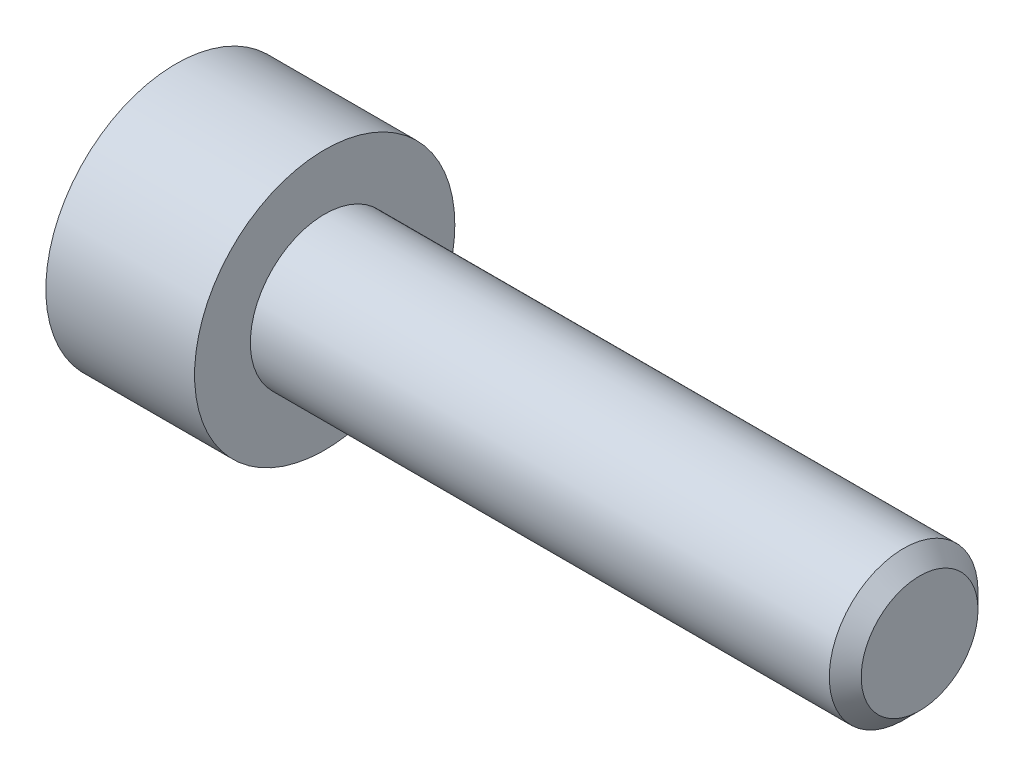
ISO-10303-21;
HEADER;
FILE_DESCRIPTION(('STEP AP214'),'2;1');
FILE_NAME('part.step','',(''),(''),'','','');
FILE_SCHEMA(('AUTOMOTIVE_DESIGN { 1 0 10303 214 1 1 1 1 }'));
ENDSEC;
DATA;
#1=APPLICATION_CONTEXT('core data for automotive mechanical design processes');
#2=APPLICATION_PROTOCOL_DEFINITION('international standard','automotive_design',2000,#1);
#3=PRODUCT_CONTEXT('',#1,'mechanical');
#4=PRODUCT('Part','Part','',(#3));
#5=PRODUCT_RELATED_PRODUCT_CATEGORY('part','',(#4));
#6=PRODUCT_DEFINITION_FORMATION('','',#4);
#7=PRODUCT_DEFINITION_CONTEXT('part definition',#1,'design');
#8=PRODUCT_DEFINITION('design','',#6,#7);
#9=PRODUCT_DEFINITION_SHAPE('','',#8);
#10=(LENGTH_UNIT() NAMED_UNIT(*) SI_UNIT(.MILLI.,.METRE.));
#11=(NAMED_UNIT(*) PLANE_ANGLE_UNIT() SI_UNIT($,.RADIAN.));
#12=(NAMED_UNIT(*) SI_UNIT($,.STERADIAN.) SOLID_ANGLE_UNIT());
#13=UNCERTAINTY_MEASURE_WITH_UNIT(LENGTH_MEASURE(1.E-05),#10,'distance_accuracy_value','');
#14=(GEOMETRIC_REPRESENTATION_CONTEXT(3) GLOBAL_UNCERTAINTY_ASSIGNED_CONTEXT((#13)) GLOBAL_UNIT_ASSIGNED_CONTEXT((#10,
#11,#12)) REPRESENTATION_CONTEXT('',''));
#15=CARTESIAN_POINT('',(0.,0.,0.));
#16=DIRECTION('',(0.,0.,1.));
#17=DIRECTION('',(1.,0.,0.));
#18=AXIS2_PLACEMENT_3D('',#15,#16,#17);
#19=CARTESIAN_POINT('',(16.,0.,0.));
#20=DIRECTION('',(-1.,0.,0.));
#21=DIRECTION('',(0.,0.,-1.));
#22=AXIS2_PLACEMENT_3D('',#19,#20,#21);
#23=CYLINDRICAL_SURFACE('',#22,3.5);
#24=CARTESIAN_POINT('',(-4.,0.,0.));
#25=DIRECTION('',(1.,0.,0.));
#26=DIRECTION('',(0.,0.,-1.));
#27=AXIS2_PLACEMENT_3D('',#24,#25,#26);
#28=CIRCLE('',#27,3.5);
#29=CARTESIAN_POINT('',(-4.,0.,-3.5));
#30=VERTEX_POINT('',#29);
#31=EDGE_CURVE('E11',#30,#30,#28,.T.);
#32=ORIENTED_EDGE('',*,*,#31,.T.);
#33=EDGE_LOOP('',(#32));
#34=FACE_BOUND('',#33,.T.);
#35=CARTESIAN_POINT('',(0.,0.,0.));
#36=DIRECTION('',(1.,0.,0.));
#37=DIRECTION('',(0.,0.,-1.));
#38=AXIS2_PLACEMENT_3D('',#35,#36,#37);
#39=CIRCLE('',#38,3.5);
#40=CARTESIAN_POINT('',(0.,0.,-3.5));
#41=VERTEX_POINT('',#40);
#42=EDGE_CURVE('E205',#41,#41,#39,.T.);
#43=ORIENTED_EDGE('',*,*,#42,.F.);
#44=EDGE_LOOP('',(#43));
#45=FACE_BOUND('',#44,.T.);
#46=ADVANCED_FACE('F16',(#34,#45),#23,.T.);
#47=CARTESIAN_POINT('',(-4.,0.,0.));
#48=DIRECTION('',(1.,0.,0.));
#49=DIRECTION('',(0.,1.,0.));
#50=AXIS2_PLACEMENT_3D('',#47,#48,#49);
#51=PLANE('',#50);
#52=ORIENTED_EDGE('',*,*,#31,.F.);
#53=EDGE_LOOP('',(#52));
#54=FACE_BOUND('',#53,.T.);
#55=DIRECTION('',(0.,-1.,0.));
#56=VECTOR('',#55,1.);
#57=CARTESIAN_POINT('',(-4.,0.866025403784439,1.5));
#58=LINE('',#57,#56);
#59=CARTESIAN_POINT('',(-4.,0.866025403784439,1.5));
#60=VERTEX_POINT('',#59);
#61=CARTESIAN_POINT('',(-4.,-0.866025403784439,1.5));
#62=VERTEX_POINT('',#61);
#63=EDGE_CURVE('E27',#60,#62,#58,.T.);
#64=ORIENTED_EDGE('',*,*,#63,.T.);
#65=DIRECTION('',(0.,-0.5,-0.866025403784439));
#66=VECTOR('',#65,1.);
#67=CARTESIAN_POINT('',(-4.,-0.866025403784439,1.5));
#68=LINE('',#67,#66);
#69=CARTESIAN_POINT('',(-4.,-1.73205080756888,0.));
#70=VERTEX_POINT('',#69);
#71=EDGE_CURVE('E196',#62,#70,#68,.T.);
#72=ORIENTED_EDGE('',*,*,#71,.T.);
#73=DIRECTION('',(0.,0.5,-0.866025403784439));
#74=VECTOR('',#73,1.);
#75=CARTESIAN_POINT('',(-4.,-1.73205080756888,0.));
#76=LINE('',#75,#74);
#77=CARTESIAN_POINT('',(-4.,-0.866025403784439,-1.5));
#78=VERTEX_POINT('',#77);
#79=EDGE_CURVE('E200',#70,#78,#76,.T.);
#80=ORIENTED_EDGE('',*,*,#79,.T.);
#81=DIRECTION('',(0.,1.,0.));
#82=VECTOR('',#81,1.);
#83=CARTESIAN_POINT('',(-4.,-0.866025403784439,-1.5));
#84=LINE('',#83,#82);
#85=CARTESIAN_POINT('',(-4.,0.866025403784438,-1.5));
#86=VERTEX_POINT('',#85);
#87=EDGE_CURVE('E223',#78,#86,#84,.T.);
#88=ORIENTED_EDGE('',*,*,#87,.T.);
#89=DIRECTION('',(0.,0.5,0.866025403784439));
#90=VECTOR('',#89,1.);
#91=CARTESIAN_POINT('',(-4.,0.866025403784439,-1.5));
#92=LINE('',#91,#90);
#93=CARTESIAN_POINT('',(-4.,1.73205080756888,0.));
#94=VERTEX_POINT('',#93);
#95=EDGE_CURVE('E219',#86,#94,#92,.T.);
#96=ORIENTED_EDGE('',*,*,#95,.T.);
#97=DIRECTION('',(0.,-0.5,0.866025403784439));
#98=VECTOR('',#97,1.);
#99=CARTESIAN_POINT('',(-4.,1.73205080756888,0.));
#100=LINE('',#99,#98);
#101=EDGE_CURVE('E224',#94,#60,#100,.T.);
#102=ORIENTED_EDGE('',*,*,#101,.T.);
#103=EDGE_LOOP('',(#64,#72,#80,#88,#96,#102));
#104=FACE_BOUND('',#103,.T.);
#105=ADVANCED_FACE('F146',(#54,#104),#51,.F.);
#106=CARTESIAN_POINT('',(-2.,-0.866025403784439,1.5));
#107=DIRECTION('',(0.,0.866025403784439,-0.5));
#108=DIRECTION('',(-1.,0.,0.));
#109=AXIS2_PLACEMENT_3D('',#106,#107,#108);
#110=PLANE('',#109);
#111=ORIENTED_EDGE('',*,*,#71,.F.);
#112=DIRECTION('',(-1.,0.,0.));
#113=VECTOR('',#112,1.);
#114=CARTESIAN_POINT('',(-2.,-0.866025403784439,1.5));
#115=LINE('',#114,#113);
#116=CARTESIAN_POINT('',(-2.,-0.866025403784439,1.5));
#117=VERTEX_POINT('',#116);
#118=EDGE_CURVE('E180',#117,#62,#115,.T.);
#119=ORIENTED_EDGE('',*,*,#118,.F.);
#120=DIRECTION('',(0.,-0.5,-0.866025403784439));
#121=VECTOR('',#120,1.);
#122=CARTESIAN_POINT('',(-2.,-0.866025403784439,1.5));
#123=LINE('',#122,#121);
#124=CARTESIAN_POINT('',(-2.,-1.73205080756888,0.));
#125=VERTEX_POINT('',#124);
#126=EDGE_CURVE('E226',#117,#125,#123,.T.);
#127=ORIENTED_EDGE('',*,*,#126,.T.);
#128=DIRECTION('',(-1.,0.,0.));
#129=VECTOR('',#128,1.);
#130=CARTESIAN_POINT('',(-2.,-1.73205080756888,0.));
#131=LINE('',#130,#129);
#132=EDGE_CURVE('E85',#125,#70,#131,.T.);
#133=ORIENTED_EDGE('',*,*,#132,.T.);
#134=EDGE_LOOP('',(#111,#119,#127,#133));
#135=FACE_BOUND('',#134,.T.);
#136=ADVANCED_FACE('F152',(#135),#110,.T.);
#137=CARTESIAN_POINT('',(-2.,-1.73205080756888,0.));
#138=DIRECTION('',(0.,0.866025403784439,0.5));
#139=DIRECTION('',(1.,0.,0.));
#140=AXIS2_PLACEMENT_3D('',#137,#138,#139);
#141=PLANE('',#140);
#142=ORIENTED_EDGE('',*,*,#79,.F.);
#143=ORIENTED_EDGE('',*,*,#132,.F.);
#144=DIRECTION('',(0.,0.5,-0.866025403784439));
#145=VECTOR('',#144,1.);
#146=CARTESIAN_POINT('',(-2.,-1.73205080756888,0.));
#147=LINE('',#146,#145);
#148=CARTESIAN_POINT('',(-2.,-0.866025403784439,-1.5));
#149=VERTEX_POINT('',#148);
#150=EDGE_CURVE('E20',#125,#149,#147,.T.);
#151=ORIENTED_EDGE('',*,*,#150,.T.);
#152=DIRECTION('',(-1.,0.,0.));
#153=VECTOR('',#152,1.);
#154=CARTESIAN_POINT('',(-2.,-0.866025403784439,-1.5));
#155=LINE('',#154,#153);
#156=EDGE_CURVE('E99',#149,#78,#155,.T.);
#157=ORIENTED_EDGE('',*,*,#156,.T.);
#158=EDGE_LOOP('',(#142,#143,#151,#157));
#159=FACE_BOUND('',#158,.T.);
#160=ADVANCED_FACE('F248',(#159),#141,.T.);
#161=CARTESIAN_POINT('',(-2.,0.866025403784439,1.5));
#162=DIRECTION('',(0.,0.,-1.));
#163=DIRECTION('',(0.,-1.,0.));
#164=AXIS2_PLACEMENT_3D('',#161,#162,#163);
#165=PLANE('',#164);
#166=ORIENTED_EDGE('',*,*,#63,.F.);
#167=DIRECTION('',(-1.,0.,0.));
#168=VECTOR('',#167,1.);
#169=CARTESIAN_POINT('',(-2.,0.866025403784439,1.5));
#170=LINE('',#169,#168);
#171=CARTESIAN_POINT('',(-2.,0.866025403784439,1.5));
#172=VERTEX_POINT('',#171);
#173=EDGE_CURVE('E233',#172,#60,#170,.T.);
#174=ORIENTED_EDGE('',*,*,#173,.F.);
#175=DIRECTION('',(0.,-1.,0.));
#176=VECTOR('',#175,1.);
#177=CARTESIAN_POINT('',(-2.,0.866025403784439,1.5));
#178=LINE('',#177,#176);
#179=EDGE_CURVE('E187',#172,#117,#178,.T.);
#180=ORIENTED_EDGE('',*,*,#179,.T.);
#181=ORIENTED_EDGE('',*,*,#118,.T.);
#182=EDGE_LOOP('',(#166,#174,#180,#181));
#183=FACE_BOUND('',#182,.T.);
#184=ADVANCED_FACE('F18',(#183),#165,.T.);
#185=CARTESIAN_POINT('',(16.,1.5705,0.));
#186=DIRECTION('',(-1.,0.,0.));
#187=DIRECTION('',(0.,0.,1.));
#188=AXIS2_PLACEMENT_3D('',#185,#186,#187);
#189=PLANE('',#188);
#190=CARTESIAN_POINT('',(16.,0.,0.));
#191=DIRECTION('',(1.,0.,0.));
#192=DIRECTION('',(0.,0.,-1.));
#193=AXIS2_PLACEMENT_3D('',#190,#191,#192);
#194=CIRCLE('',#193,1.5705);
#195=CARTESIAN_POINT('',(16.,0.,-1.5705));
#196=VERTEX_POINT('',#195);
#197=EDGE_CURVE('E178',#196,#196,#194,.T.);
#198=ORIENTED_EDGE('',*,*,#197,.T.);
#199=EDGE_LOOP('',(#198));
#200=FACE_BOUND('',#199,.T.);
#201=ADVANCED_FACE('F164',(#200),#189,.F.);
#202=CARTESIAN_POINT('',(15.5705,0.,0.));
#203=DIRECTION('',(-1.,0.,0.));
#204=DIRECTION('',(0.,0.,1.));
#205=AXIS2_PLACEMENT_3D('',#202,#203,#204);
#206=CONICAL_SURFACE('',#205,2.,0.785398163397445);
#207=CARTESIAN_POINT('',(15.5705,0.,0.));
#208=DIRECTION('',(1.,0.,0.));
#209=DIRECTION('',(0.,0.,-1.));
#210=AXIS2_PLACEMENT_3D('',#207,#208,#209);
#211=CIRCLE('',#210,2.);
#212=CARTESIAN_POINT('',(15.5705,0.,-2.));
#213=VERTEX_POINT('',#212);
#214=EDGE_CURVE('E176',#213,#213,#211,.T.);
#215=ORIENTED_EDGE('',*,*,#214,.T.);
#216=EDGE_LOOP('',(#215));
#217=FACE_BOUND('',#216,.T.);
#218=ORIENTED_EDGE('',*,*,#197,.F.);
#219=EDGE_LOOP('',(#218));
#220=FACE_BOUND('',#219,.T.);
#221=ADVANCED_FACE('F162',(#217,#220),#206,.T.);
#222=CARTESIAN_POINT('',(16.,0.,0.));
#223=DIRECTION('',(-1.,0.,0.));
#224=DIRECTION('',(0.,0.,-1.));
#225=AXIS2_PLACEMENT_3D('',#222,#223,#224);
#226=CYLINDRICAL_SURFACE('',#225,2.);
#227=CARTESIAN_POINT('',(0.,0.,0.));
#228=DIRECTION('',(1.,0.,0.));
#229=DIRECTION('',(0.,0.,-1.));
#230=AXIS2_PLACEMENT_3D('',#227,#228,#229);
#231=CIRCLE('',#230,2.);
#232=CARTESIAN_POINT('',(0.,0.,-2.));
#233=VERTEX_POINT('',#232);
#234=EDGE_CURVE('E189',#233,#233,#231,.T.);
#235=ORIENTED_EDGE('',*,*,#234,.T.);
#236=EDGE_LOOP('',(#235));
#237=FACE_BOUND('',#236,.T.);
#238=ORIENTED_EDGE('',*,*,#214,.F.);
#239=EDGE_LOOP('',(#238));
#240=FACE_BOUND('',#239,.T.);
#241=ADVANCED_FACE('F160',(#237,#240),#226,.T.);
#242=CARTESIAN_POINT('',(0.,3.5,0.));
#243=DIRECTION('',(-1.,0.,0.));
#244=DIRECTION('',(0.,0.,1.));
#245=AXIS2_PLACEMENT_3D('',#242,#243,#244);
#246=PLANE('',#245);
#247=ORIENTED_EDGE('',*,*,#42,.T.);
#248=EDGE_LOOP('',(#247));
#249=FACE_BOUND('',#248,.T.);
#250=ORIENTED_EDGE('',*,*,#234,.F.);
#251=EDGE_LOOP('',(#250));
#252=FACE_BOUND('',#251,.T.);
#253=ADVANCED_FACE('F157',(#249,#252),#246,.F.);
#254=CARTESIAN_POINT('',(-2.,-0.866025403784439,-1.5));
#255=DIRECTION('',(0.,0.,1.));
#256=DIRECTION('',(1.,0.,0.));
#257=AXIS2_PLACEMENT_3D('',#254,#255,#256);
#258=PLANE('',#257);
#259=ORIENTED_EDGE('',*,*,#87,.F.);
#260=ORIENTED_EDGE('',*,*,#156,.F.);
#261=DIRECTION('',(0.,1.,0.));
#262=VECTOR('',#261,1.);
#263=CARTESIAN_POINT('',(-2.,-0.866025403784439,-1.5));
#264=LINE('',#263,#262);
#265=CARTESIAN_POINT('',(-2.,0.866025403784438,-1.5));
#266=VERTEX_POINT('',#265);
#267=EDGE_CURVE('E202',#149,#266,#264,.T.);
#268=ORIENTED_EDGE('',*,*,#267,.T.);
#269=DIRECTION('',(-1.,0.,0.));
#270=VECTOR('',#269,1.);
#271=CARTESIAN_POINT('',(-2.,0.866025403784438,-1.5));
#272=LINE('',#271,#270);
#273=EDGE_CURVE('E115',#266,#86,#272,.T.);
#274=ORIENTED_EDGE('',*,*,#273,.T.);
#275=EDGE_LOOP('',(#259,#260,#268,#274));
#276=FACE_BOUND('',#275,.T.);
#277=ADVANCED_FACE('F159',(#276),#258,.T.);
#278=CARTESIAN_POINT('',(-2.,0.866025403784439,-1.5));
#279=DIRECTION('',(0.,-0.866025403784439,0.5));
#280=DIRECTION('',(-1.,0.,0.));
#281=AXIS2_PLACEMENT_3D('',#278,#279,#280);
#282=PLANE('',#281);
#283=ORIENTED_EDGE('',*,*,#95,.F.);
#284=ORIENTED_EDGE('',*,*,#273,.F.);
#285=DIRECTION('',(0.,0.5,0.866025403784439));
#286=VECTOR('',#285,1.);
#287=CARTESIAN_POINT('',(-2.,0.866025403784439,-1.5));
#288=LINE('',#287,#286);
#289=CARTESIAN_POINT('',(-2.,1.73205080756888,0.));
#290=VERTEX_POINT('',#289);
#291=EDGE_CURVE('E194',#266,#290,#288,.T.);
#292=ORIENTED_EDGE('',*,*,#291,.T.);
#293=DIRECTION('',(-1.,0.,0.));
#294=VECTOR('',#293,1.);
#295=CARTESIAN_POINT('',(-2.,1.73205080756888,0.));
#296=LINE('',#295,#294);
#297=EDGE_CURVE('E122',#290,#94,#296,.T.);
#298=ORIENTED_EDGE('',*,*,#297,.T.);
#299=EDGE_LOOP('',(#283,#284,#292,#298));
#300=FACE_BOUND('',#299,.T.);
#301=ADVANCED_FACE('F255',(#300),#282,.T.);
#302=CARTESIAN_POINT('',(-2.,1.73205080756888,0.));
#303=DIRECTION('',(0.,-0.866025403784439,-0.5));
#304=DIRECTION('',(0.,0.5,-0.866025403784439));
#305=AXIS2_PLACEMENT_3D('',#302,#303,#304);
#306=PLANE('',#305);
#307=ORIENTED_EDGE('',*,*,#101,.F.);
#308=ORIENTED_EDGE('',*,*,#297,.F.);
#309=DIRECTION('',(0.,-0.5,0.866025403784439));
#310=VECTOR('',#309,1.);
#311=CARTESIAN_POINT('',(-2.,1.73205080756888,0.));
#312=LINE('',#311,#310);
#313=EDGE_CURVE('E216',#290,#172,#312,.T.);
#314=ORIENTED_EDGE('',*,*,#313,.T.);
#315=ORIENTED_EDGE('',*,*,#173,.T.);
#316=EDGE_LOOP('',(#307,#308,#314,#315));
#317=FACE_BOUND('',#316,.T.);
#318=ADVANCED_FACE('F140',(#317),#306,.T.);
#319=CARTESIAN_POINT('',(-2.,0.,0.));
#320=DIRECTION('',(1.,0.,0.));
#321=DIRECTION('',(0.,1.,0.));
#322=AXIS2_PLACEMENT_3D('',#319,#320,#321);
#323=PLANE('',#322);
#324=ORIENTED_EDGE('',*,*,#179,.F.);
#325=ORIENTED_EDGE('',*,*,#313,.F.);
#326=ORIENTED_EDGE('',*,*,#291,.F.);
#327=ORIENTED_EDGE('',*,*,#267,.F.);
#328=ORIENTED_EDGE('',*,*,#150,.F.);
#329=ORIENTED_EDGE('',*,*,#126,.F.);
#330=EDGE_LOOP('',(#324,#325,#326,#327,#328,#329));
#331=FACE_BOUND('',#330,.T.);
#332=CARTESIAN_POINT('',(-2.,0.,0.));
#333=DIRECTION('',(1.,0.,0.));
#334=DIRECTION('',(0.,0.,-1.));
#335=AXIS2_PLACEMENT_3D('',#332,#333,#334);
#336=CIRCLE('',#335,1.49);
#337=CARTESIAN_POINT('',(-2.,0.,-1.49));
#338=VERTEX_POINT('',#337);
#339=EDGE_CURVE('E128',#338,#338,#336,.T.);
#340=ORIENTED_EDGE('',*,*,#339,.T.);
#341=EDGE_LOOP('',(#340));
#342=FACE_BOUND('',#341,.T.);
#343=ADVANCED_FACE('F134',(#331,#342),#323,.F.);
#344=CARTESIAN_POINT('',(-2.,0.,0.));
#345=DIRECTION('',(-1.,0.,0.));
#346=DIRECTION('',(0.,0.,1.));
#347=AXIS2_PLACEMENT_3D('',#344,#345,#346);
#348=CONICAL_SURFACE('',#347,1.49,1.0471975511966);
#349=ORIENTED_EDGE('',*,*,#339,.F.);
#350=EDGE_LOOP('',(#349));
#351=FACE_BOUND('',#350,.T.);
#352=CARTESIAN_POINT('',(-1.13974809890746,0.,0.));
#353=VERTEX_POINT('',#352);
#354=VERTEX_LOOP('',#353);
#355=FACE_BOUND('',#354,.T.);
#356=ADVANCED_FACE('F132',(#351,#355),#348,.F.);
#357=CLOSED_SHELL('',(#46,#105,#136,#160,#184,#201,#221,#241,#253,#277,#301,#318,#343,#356));
#358=MANIFOLD_SOLID_BREP('B1',#357);
#359=ADVANCED_BREP_SHAPE_REPRESENTATION('',(#18,#358),#14);
#360=SHAPE_DEFINITION_REPRESENTATION(#9,#359);
ENDSEC;
END-ISO-10303-21;
